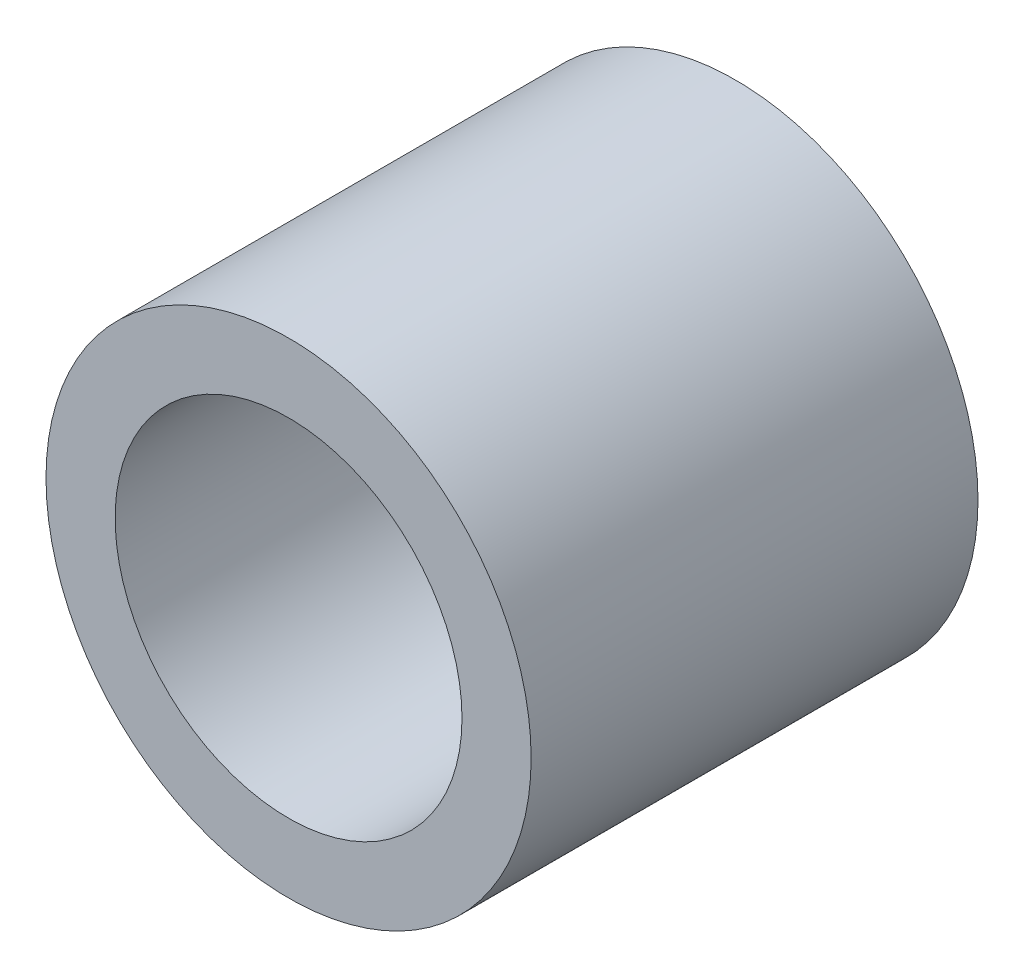
ISO-10303-21;
HEADER;
FILE_DESCRIPTION(('STEP AP214'),'2;1');
FILE_NAME('part.step','',(''),(''),'','','');
FILE_SCHEMA(('AUTOMOTIVE_DESIGN { 1 0 10303 214 1 1 1 1 }'));
ENDSEC;
DATA;
#1=APPLICATION_CONTEXT('core data for automotive mechanical design processes');
#2=APPLICATION_PROTOCOL_DEFINITION('international standard','automotive_design',2000,#1);
#3=PRODUCT_CONTEXT('',#1,'mechanical');
#4=PRODUCT('Part','Part','',(#3));
#5=PRODUCT_RELATED_PRODUCT_CATEGORY('part','',(#4));
#6=PRODUCT_DEFINITION_FORMATION('','',#4);
#7=PRODUCT_DEFINITION_CONTEXT('part definition',#1,'design');
#8=PRODUCT_DEFINITION('design','',#6,#7);
#9=PRODUCT_DEFINITION_SHAPE('','',#8);
#10=(LENGTH_UNIT() NAMED_UNIT(*) SI_UNIT(.MILLI.,.METRE.));
#11=(NAMED_UNIT(*) PLANE_ANGLE_UNIT() SI_UNIT($,.RADIAN.));
#12=(NAMED_UNIT(*) SI_UNIT($,.STERADIAN.) SOLID_ANGLE_UNIT());
#13=UNCERTAINTY_MEASURE_WITH_UNIT(LENGTH_MEASURE(1.E-05),#10,'distance_accuracy_value','');
#14=(GEOMETRIC_REPRESENTATION_CONTEXT(3) GLOBAL_UNCERTAINTY_ASSIGNED_CONTEXT((#13)) GLOBAL_UNIT_ASSIGNED_CONTEXT((#10,
#11,#12)) REPRESENTATION_CONTEXT('',''));
#15=CARTESIAN_POINT('',(0.,0.,0.));
#16=DIRECTION('',(0.,0.,1.));
#17=DIRECTION('',(1.,0.,0.));
#18=AXIS2_PLACEMENT_3D('',#15,#16,#17);
#19=CARTESIAN_POINT('',(0.,0.,10.2362));
#20=DIRECTION('',(0.,0.,1.));
#21=DIRECTION('',(1.,0.,0.));
#22=AXIS2_PLACEMENT_3D('',#19,#20,#21);
#23=PLANE('',#22);
#24=CARTESIAN_POINT('',(0.,0.,10.2362));
#25=DIRECTION('',(0.,0.,1.));
#26=DIRECTION('',(1.,0.,0.));
#27=AXIS2_PLACEMENT_3D('',#24,#25,#26);
#28=CIRCLE('',#27,5.55625);
#29=CARTESIAN_POINT('',(5.55625,0.,10.2362));
#30=VERTEX_POINT('',#29);
#31=EDGE_CURVE('E10',#30,#30,#28,.T.);
#32=ORIENTED_EDGE('',*,*,#31,.T.);
#33=EDGE_LOOP('',(#32));
#34=FACE_BOUND('',#33,.T.);
#35=CARTESIAN_POINT('',(0.,0.,10.2362));
#36=DIRECTION('',(0.,0.,1.));
#37=DIRECTION('',(1.,0.,0.));
#38=AXIS2_PLACEMENT_3D('',#35,#36,#37);
#39=CIRCLE('',#38,3.97256);
#40=CARTESIAN_POINT('',(3.97256,0.,10.2362));
#41=VERTEX_POINT('',#40);
#42=EDGE_CURVE('E56',#41,#41,#39,.T.);
#43=ORIENTED_EDGE('',*,*,#42,.F.);
#44=EDGE_LOOP('',(#43));
#45=FACE_BOUND('',#44,.T.);
#46=ADVANCED_FACE('F43',(#34,#45),#23,.T.);
#47=CARTESIAN_POINT('',(0.,0.,0.));
#48=DIRECTION('',(0.,0.,1.));
#49=DIRECTION('',(1.,0.,0.));
#50=AXIS2_PLACEMENT_3D('',#47,#48,#49);
#51=PLANE('',#50);
#52=CARTESIAN_POINT('',(0.,0.,0.));
#53=DIRECTION('',(0.,0.,1.));
#54=DIRECTION('',(1.,0.,0.));
#55=AXIS2_PLACEMENT_3D('',#52,#53,#54);
#56=CIRCLE('',#55,5.55625);
#57=CARTESIAN_POINT('',(5.55625,0.,0.));
#58=VERTEX_POINT('',#57);
#59=EDGE_CURVE('E47',#58,#58,#56,.T.);
#60=ORIENTED_EDGE('',*,*,#59,.F.);
#61=EDGE_LOOP('',(#60));
#62=FACE_BOUND('',#61,.T.);
#63=CARTESIAN_POINT('',(0.,0.,0.));
#64=DIRECTION('',(0.,0.,1.));
#65=DIRECTION('',(1.,0.,0.));
#66=AXIS2_PLACEMENT_3D('',#63,#64,#65);
#67=CIRCLE('',#66,3.97256);
#68=CARTESIAN_POINT('',(3.97256,0.,0.));
#69=VERTEX_POINT('',#68);
#70=EDGE_CURVE('E58',#69,#69,#67,.T.);
#71=ORIENTED_EDGE('',*,*,#70,.T.);
#72=EDGE_LOOP('',(#71));
#73=FACE_BOUND('',#72,.T.);
#74=ADVANCED_FACE('F70',(#62,#73),#51,.F.);
#75=CARTESIAN_POINT('',(0.,0.,10.2362));
#76=DIRECTION('',(0.,0.,-1.));
#77=DIRECTION('',(-1.,0.,0.));
#78=AXIS2_PLACEMENT_3D('',#75,#76,#77);
#79=CYLINDRICAL_SURFACE('',#78,5.55625);
#80=ORIENTED_EDGE('',*,*,#31,.F.);
#81=EDGE_LOOP('',(#80));
#82=FACE_BOUND('',#81,.T.);
#83=ORIENTED_EDGE('',*,*,#59,.T.);
#84=EDGE_LOOP('',(#83));
#85=FACE_BOUND('',#84,.T.);
#86=ADVANCED_FACE('F45',(#82,#85),#79,.T.);
#87=CARTESIAN_POINT('',(0.,0.,10.2362));
#88=DIRECTION('',(0.,0.,-1.));
#89=DIRECTION('',(-1.,0.,0.));
#90=AXIS2_PLACEMENT_3D('',#87,#88,#89);
#91=CYLINDRICAL_SURFACE('',#90,3.97256);
#92=ORIENTED_EDGE('',*,*,#42,.T.);
#93=EDGE_LOOP('',(#92));
#94=FACE_BOUND('',#93,.T.);
#95=ORIENTED_EDGE('',*,*,#70,.F.);
#96=EDGE_LOOP('',(#95));
#97=FACE_BOUND('',#96,.T.);
#98=ADVANCED_FACE('F66',(#94,#97),#91,.F.);
#99=CLOSED_SHELL('',(#46,#74,#86,#98));
#100=MANIFOLD_SOLID_BREP('B2',#99);
#101=ADVANCED_BREP_SHAPE_REPRESENTATION('',(#18,#100),#14);
#102=SHAPE_DEFINITION_REPRESENTATION(#9,#101);
ENDSEC;
END-ISO-10303-21;
